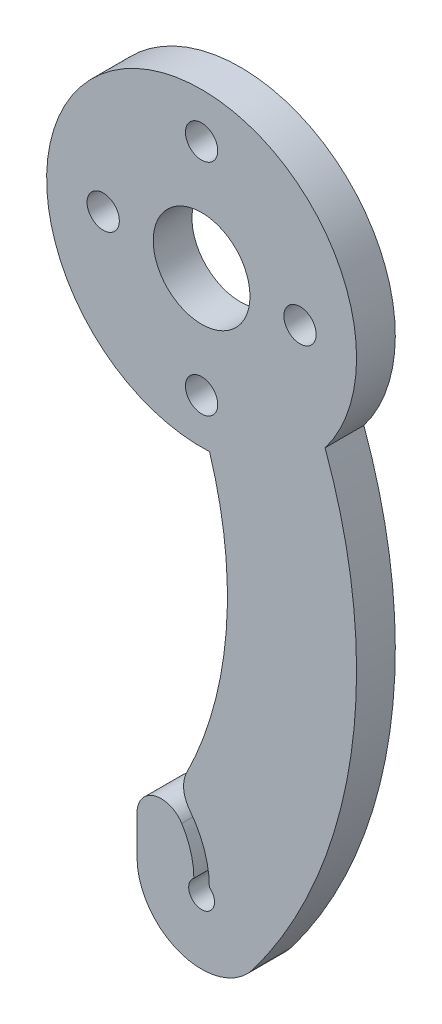
ISO-10303-21;
HEADER;
FILE_DESCRIPTION(('STEP AP214'),'2;1');
FILE_NAME('part.step','',(''),(''),'','','');
FILE_SCHEMA(('AUTOMOTIVE_DESIGN { 1 0 10303 214 1 1 1 1 }'));
ENDSEC;
DATA;
#1=APPLICATION_CONTEXT('core data for automotive mechanical design processes');
#2=APPLICATION_PROTOCOL_DEFINITION('international standard','automotive_design',2000,#1);
#3=PRODUCT_CONTEXT('',#1,'mechanical');
#4=PRODUCT('Part','Part','',(#3));
#5=PRODUCT_RELATED_PRODUCT_CATEGORY('part','',(#4));
#6=PRODUCT_DEFINITION_FORMATION('','',#4);
#7=PRODUCT_DEFINITION_CONTEXT('part definition',#1,'design');
#8=PRODUCT_DEFINITION('design','',#6,#7);
#9=PRODUCT_DEFINITION_SHAPE('','',#8);
#10=(LENGTH_UNIT() NAMED_UNIT(*) SI_UNIT(.MILLI.,.METRE.));
#11=(NAMED_UNIT(*) PLANE_ANGLE_UNIT() SI_UNIT($,.RADIAN.));
#12=(NAMED_UNIT(*) SI_UNIT($,.STERADIAN.) SOLID_ANGLE_UNIT());
#13=UNCERTAINTY_MEASURE_WITH_UNIT(LENGTH_MEASURE(1.E-05),#10,'distance_accuracy_value','');
#14=(GEOMETRIC_REPRESENTATION_CONTEXT(3) GLOBAL_UNCERTAINTY_ASSIGNED_CONTEXT((#13)) GLOBAL_UNIT_ASSIGNED_CONTEXT((#10,
#11,#12)) REPRESENTATION_CONTEXT('',''));
#15=CARTESIAN_POINT('',(0.,0.,0.));
#16=DIRECTION('',(0.,0.,1.));
#17=DIRECTION('',(1.,0.,0.));
#18=AXIS2_PLACEMENT_3D('',#15,#16,#17);
#19=CARTESIAN_POINT('',(-28.,-21.,3.));
#20=DIRECTION('',(0.,0.,-1.));
#21=DIRECTION('',(-1.,0.,0.));
#22=AXIS2_PLACEMENT_3D('',#19,#20,#21);
#23=PLANE('',#22);
#24=CARTESIAN_POINT('',(0.,-8.509,3.));
#25=DIRECTION('',(0.,0.,1.));
#26=DIRECTION('',(1.,0.,0.));
#27=AXIS2_PLACEMENT_3D('',#24,#25,#26);
#28=CIRCLE('',#27,1.25);
#29=CARTESIAN_POINT('',(1.25,-8.509,3.));
#30=VERTEX_POINT('',#29);
#31=EDGE_CURVE('E222',#30,#30,#28,.T.);
#32=ORIENTED_EDGE('',*,*,#31,.F.);
#33=EDGE_LOOP('',(#32));
#34=FACE_BOUND('',#33,.T.);
#35=CARTESIAN_POINT('',(0.,8.509,3.));
#36=DIRECTION('',(0.,0.,1.));
#37=DIRECTION('',(1.,0.,0.));
#38=AXIS2_PLACEMENT_3D('',#35,#36,#37);
#39=CIRCLE('',#38,1.25);
#40=CARTESIAN_POINT('',(1.24999999999999,8.509,3.));
#41=VERTEX_POINT('',#40);
#42=EDGE_CURVE('E210',#41,#41,#39,.T.);
#43=ORIENTED_EDGE('',*,*,#42,.F.);
#44=EDGE_LOOP('',(#43));
#45=FACE_BOUND('',#44,.T.);
#46=CARTESIAN_POINT('',(-28.,-21.,3.));
#47=DIRECTION('',(0.,0.,1.));
#48=DIRECTION('',(-1.,0.,0.));
#49=AXIS2_PLACEMENT_3D('',#46,#47,#48);
#50=CIRCLE('',#49,40.);
#51=CARTESIAN_POINT('',(4.00000000000001,-45.,3.));
#52=VERTEX_POINT('',#51);
#53=CARTESIAN_POINT('',(9.56239842829059,-7.24986457105411,3.));
#54=VERTEX_POINT('',#53);
#55=EDGE_CURVE('E159',#52,#54,#50,.T.);
#56=ORIENTED_EDGE('',*,*,#55,.T.);
#57=CARTESIAN_POINT('',(0.,0.,3.));
#58=DIRECTION('',(0.,0.,1.));
#59=DIRECTION('',(1.,0.,0.));
#60=AXIS2_PLACEMENT_3D('',#57,#58,#59);
#61=CIRCLE('',#60,12.);
#62=CARTESIAN_POINT('',(0.613240326656881,-11.9843204355425,3.));
#63=VERTEX_POINT('',#62);
#64=EDGE_CURVE('E97',#54,#63,#61,.T.);
#65=ORIENTED_EDGE('',*,*,#64,.T.);
#66=CARTESIAN_POINT('',(-28.,-21.,3.));
#67=DIRECTION('',(0.,0.,-1.));
#68=DIRECTION('',(-1.,0.,0.));
#69=AXIS2_PLACEMENT_3D('',#66,#67,#68);
#70=CIRCLE('',#69,30.);
#71=CARTESIAN_POINT('',(-1.15567211024812,-34.3933588075393,3.));
#72=VERTEX_POINT('',#71);
#73=EDGE_CURVE('E180',#63,#72,#70,.T.);
#74=ORIENTED_EDGE('',*,*,#73,.T.);
#75=CARTESIAN_POINT('',(0.867703118816565,-35.4028752519981,3.));
#76=DIRECTION('',(0.,0.,1.));
#77=DIRECTION('',(-1.,0.,0.));
#78=AXIS2_PLACEMENT_3D('',#75,#76,#77);
#79=CIRCLE('',#78,2.26123213519211);
#80=CARTESIAN_POINT('',(-0.915279992086807,-36.7936095887637,3.));
#81=VERTEX_POINT('',#80);
#82=EDGE_CURVE('E199',#72,#81,#79,.T.);
#83=ORIENTED_EDGE('',*,*,#82,.T.);
#84=CARTESIAN_POINT('',(-6.56446796105055,-41.2,3.));
#85=DIRECTION('',(0.,0.,-1.));
#86=DIRECTION('',(-1.,0.,0.));
#87=AXIS2_PLACEMENT_3D('',#84,#85,#86);
#88=CIRCLE('',#87,7.16446796105055);
#89=CARTESIAN_POINT('',(0.600000000000003,-41.2,3.));
#90=VERTEX_POINT('',#89);
#91=EDGE_CURVE('E196',#81,#90,#88,.T.);
#92=ORIENTED_EDGE('',*,*,#91,.T.);
#93=CARTESIAN_POINT('',(0.,-42.,3.));
#94=DIRECTION('',(0.,0.,-1.));
#95=DIRECTION('',(1.,0.,0.));
#96=AXIS2_PLACEMENT_3D('',#93,#94,#95);
#97=CIRCLE('',#96,1.);
#98=CARTESIAN_POINT('',(-0.599999999999995,-41.2,3.));
#99=VERTEX_POINT('',#98);
#100=EDGE_CURVE('E198',#90,#99,#97,.T.);
#101=ORIENTED_EDGE('',*,*,#100,.T.);
#102=CARTESIAN_POINT('',(-6.56446796105055,-41.2,3.));
#103=DIRECTION('',(0.,0.,1.));
#104=DIRECTION('',(-1.,0.,0.));
#105=AXIS2_PLACEMENT_3D('',#102,#103,#104);
#106=CIRCLE('',#105,5.96446796105056);
#107=CARTESIAN_POINT('',(-1.53841797830197,-37.9885050787349,3.));
#108=VERTEX_POINT('',#107);
#109=EDGE_CURVE('E122',#99,#108,#106,.T.);
#110=ORIENTED_EDGE('',*,*,#109,.T.);
#111=CARTESIAN_POINT('',(-3.12142656346644,-39.,3.));
#112=DIRECTION('',(0.,0.,1.));
#113=DIRECTION('',(-1.,0.,0.));
#114=AXIS2_PLACEMENT_3D('',#111,#112,#113);
#115=CIRCLE('',#114,1.87857343653356);
#116=CARTESIAN_POINT('',(-5.,-39.,3.));
#117=VERTEX_POINT('',#116);
#118=EDGE_CURVE('E116',#108,#117,#115,.T.);
#119=ORIENTED_EDGE('',*,*,#118,.T.);
#120=DIRECTION('',(0.,-1.,0.));
#121=VECTOR('',#120,1.);
#122=CARTESIAN_POINT('',(-4.99999999999999,-42.,3.));
#123=LINE('',#122,#121);
#124=CARTESIAN_POINT('',(-4.99999999999999,-42.,3.));
#125=VERTEX_POINT('',#124);
#126=EDGE_CURVE('E120',#117,#125,#123,.T.);
#127=ORIENTED_EDGE('',*,*,#126,.T.);
#128=CARTESIAN_POINT('',(0.,-42.,3.));
#129=DIRECTION('',(0.,0.,1.));
#130=DIRECTION('',(-1.,0.,0.));
#131=AXIS2_PLACEMENT_3D('',#128,#129,#130);
#132=CIRCLE('',#131,5.);
#133=EDGE_CURVE('E48',#125,#52,#132,.T.);
#134=ORIENTED_EDGE('',*,*,#133,.T.);
#135=EDGE_LOOP('',(#56,#65,#74,#83,#92,#101,#110,#119,#127,#134));
#136=FACE_BOUND('',#135,.T.);
#137=CARTESIAN_POINT('',(0.,0.,3.));
#138=DIRECTION('',(0.,0.,1.));
#139=DIRECTION('',(1.,0.,0.));
#140=AXIS2_PLACEMENT_3D('',#137,#138,#139);
#141=CIRCLE('',#140,3.7465);
#142=CARTESIAN_POINT('',(3.74649999999999,0.,3.));
#143=VERTEX_POINT('',#142);
#144=EDGE_CURVE('E144',#143,#143,#141,.T.);
#145=ORIENTED_EDGE('',*,*,#144,.F.);
#146=EDGE_LOOP('',(#145));
#147=FACE_BOUND('',#146,.T.);
#148=CARTESIAN_POINT('',(-7.62,0.,3.));
#149=DIRECTION('',(0.,0.,1.));
#150=DIRECTION('',(1.,0.,0.));
#151=AXIS2_PLACEMENT_3D('',#148,#149,#150);
#152=CIRCLE('',#151,1.25);
#153=CARTESIAN_POINT('',(-6.37,0.,3.));
#154=VERTEX_POINT('',#153);
#155=EDGE_CURVE('E216',#154,#154,#152,.T.);
#156=ORIENTED_EDGE('',*,*,#155,.F.);
#157=EDGE_LOOP('',(#156));
#158=FACE_BOUND('',#157,.T.);
#159=CARTESIAN_POINT('',(7.62,0.,3.));
#160=DIRECTION('',(0.,0.,1.));
#161=DIRECTION('',(1.,0.,0.));
#162=AXIS2_PLACEMENT_3D('',#159,#160,#161);
#163=CIRCLE('',#162,1.25);
#164=CARTESIAN_POINT('',(8.87,0.,3.));
#165=VERTEX_POINT('',#164);
#166=EDGE_CURVE('E228',#165,#165,#163,.T.);
#167=ORIENTED_EDGE('',*,*,#166,.F.);
#168=EDGE_LOOP('',(#167));
#169=FACE_BOUND('',#168,.T.);
#170=ADVANCED_FACE('F31',(#34,#45,#136,#147,#158,#169),#23,.F.);
#171=CARTESIAN_POINT('',(-28.,-21.,0.));
#172=DIRECTION('',(0.,0.,-1.));
#173=DIRECTION('',(-1.,0.,0.));
#174=AXIS2_PLACEMENT_3D('',#171,#172,#173);
#175=PLANE('',#174);
#176=CARTESIAN_POINT('',(0.,-8.509,0.));
#177=DIRECTION('',(0.,0.,1.));
#178=DIRECTION('',(1.,0.,0.));
#179=AXIS2_PLACEMENT_3D('',#176,#177,#178);
#180=CIRCLE('',#179,1.25);
#181=CARTESIAN_POINT('',(1.25,-8.509,0.));
#182=VERTEX_POINT('',#181);
#183=EDGE_CURVE('E225',#182,#182,#180,.T.);
#184=ORIENTED_EDGE('',*,*,#183,.T.);
#185=EDGE_LOOP('',(#184));
#186=FACE_BOUND('',#185,.T.);
#187=CARTESIAN_POINT('',(0.,8.509,0.));
#188=DIRECTION('',(0.,0.,1.));
#189=DIRECTION('',(1.,0.,0.));
#190=AXIS2_PLACEMENT_3D('',#187,#188,#189);
#191=CIRCLE('',#190,1.25);
#192=CARTESIAN_POINT('',(1.24999999999999,8.509,0.));
#193=VERTEX_POINT('',#192);
#194=EDGE_CURVE('E213',#193,#193,#191,.T.);
#195=ORIENTED_EDGE('',*,*,#194,.T.);
#196=EDGE_LOOP('',(#195));
#197=FACE_BOUND('',#196,.T.);
#198=CARTESIAN_POINT('',(-28.,-21.,0.));
#199=DIRECTION('',(0.,0.,1.));
#200=DIRECTION('',(-1.,0.,0.));
#201=AXIS2_PLACEMENT_3D('',#198,#199,#200);
#202=CIRCLE('',#201,40.);
#203=CARTESIAN_POINT('',(4.00000000000001,-45.,0.));
#204=VERTEX_POINT('',#203);
#205=CARTESIAN_POINT('',(9.56239842829059,-7.24986457105411,0.));
#206=VERTEX_POINT('',#205);
#207=EDGE_CURVE('E140',#204,#206,#202,.T.);
#208=ORIENTED_EDGE('',*,*,#207,.F.);
#209=CARTESIAN_POINT('',(0.,-42.,0.));
#210=DIRECTION('',(0.,0.,1.));
#211=DIRECTION('',(-1.,0.,0.));
#212=AXIS2_PLACEMENT_3D('',#209,#210,#211);
#213=CIRCLE('',#212,5.);
#214=CARTESIAN_POINT('',(-4.99999999999999,-42.,0.));
#215=VERTEX_POINT('',#214);
#216=EDGE_CURVE('E89',#215,#204,#213,.T.);
#217=ORIENTED_EDGE('',*,*,#216,.F.);
#218=DIRECTION('',(0.,-1.,0.));
#219=VECTOR('',#218,1.);
#220=CARTESIAN_POINT('',(-4.99999999999999,-42.,0.));
#221=LINE('',#220,#219);
#222=CARTESIAN_POINT('',(-5.,-39.,0.));
#223=VERTEX_POINT('',#222);
#224=EDGE_CURVE('E83',#223,#215,#221,.T.);
#225=ORIENTED_EDGE('',*,*,#224,.F.);
#226=CARTESIAN_POINT('',(-3.12142656346644,-39.,0.));
#227=DIRECTION('',(0.,0.,1.));
#228=DIRECTION('',(-1.,0.,0.));
#229=AXIS2_PLACEMENT_3D('',#226,#227,#228);
#230=CIRCLE('',#229,1.87857343653356);
#231=CARTESIAN_POINT('',(-1.53841797830197,-37.9885050787349,0.));
#232=VERTEX_POINT('',#231);
#233=EDGE_CURVE('E130',#232,#223,#230,.T.);
#234=ORIENTED_EDGE('',*,*,#233,.F.);
#235=CARTESIAN_POINT('',(-6.56446796105055,-41.2,0.));
#236=DIRECTION('',(0.,0.,1.));
#237=DIRECTION('',(-1.,0.,0.));
#238=AXIS2_PLACEMENT_3D('',#235,#236,#237);
#239=CIRCLE('',#238,5.96446796105056);
#240=CARTESIAN_POINT('',(-0.599999999999995,-41.2,0.));
#241=VERTEX_POINT('',#240);
#242=EDGE_CURVE('E154',#241,#232,#239,.T.);
#243=ORIENTED_EDGE('',*,*,#242,.F.);
#244=CARTESIAN_POINT('',(0.,-42.,0.));
#245=DIRECTION('',(0.,0.,-1.));
#246=DIRECTION('',(1.,0.,0.));
#247=AXIS2_PLACEMENT_3D('',#244,#245,#246);
#248=CIRCLE('',#247,1.);
#249=CARTESIAN_POINT('',(0.600000000000003,-41.2,0.));
#250=VERTEX_POINT('',#249);
#251=EDGE_CURVE('E152',#250,#241,#248,.T.);
#252=ORIENTED_EDGE('',*,*,#251,.F.);
#253=CARTESIAN_POINT('',(-6.56446796105055,-41.2,0.));
#254=DIRECTION('',(0.,0.,-1.));
#255=DIRECTION('',(-1.,0.,0.));
#256=AXIS2_PLACEMENT_3D('',#253,#254,#255);
#257=CIRCLE('',#256,7.16446796105055);
#258=CARTESIAN_POINT('',(-0.915279992086807,-36.7936095887637,0.));
#259=VERTEX_POINT('',#258);
#260=EDGE_CURVE('E150',#259,#250,#257,.T.);
#261=ORIENTED_EDGE('',*,*,#260,.F.);
#262=CARTESIAN_POINT('',(0.867703118816565,-35.4028752519981,0.));
#263=DIRECTION('',(0.,0.,1.));
#264=DIRECTION('',(-1.,0.,0.));
#265=AXIS2_PLACEMENT_3D('',#262,#263,#264);
#266=CIRCLE('',#265,2.26123213519211);
#267=CARTESIAN_POINT('',(-1.15567211024812,-34.3933588075393,0.));
#268=VERTEX_POINT('',#267);
#269=EDGE_CURVE('E148',#268,#259,#266,.T.);
#270=ORIENTED_EDGE('',*,*,#269,.F.);
#271=CARTESIAN_POINT('',(-28.,-21.,0.));
#272=DIRECTION('',(0.,0.,-1.));
#273=DIRECTION('',(-1.,0.,0.));
#274=AXIS2_PLACEMENT_3D('',#271,#272,#273);
#275=CIRCLE('',#274,30.);
#276=CARTESIAN_POINT('',(0.613240326656881,-11.9843204355425,0.));
#277=VERTEX_POINT('',#276);
#278=EDGE_CURVE('E146',#277,#268,#275,.T.);
#279=ORIENTED_EDGE('',*,*,#278,.F.);
#280=CARTESIAN_POINT('',(0.,0.,0.));
#281=DIRECTION('',(0.,0.,1.));
#282=DIRECTION('',(1.,0.,0.));
#283=AXIS2_PLACEMENT_3D('',#280,#281,#282);
#284=CIRCLE('',#283,12.);
#285=EDGE_CURVE('E143',#206,#277,#284,.T.);
#286=ORIENTED_EDGE('',*,*,#285,.F.);
#287=EDGE_LOOP('',(#208,#217,#225,#234,#243,#252,#261,#270,#279,#286));
#288=FACE_BOUND('',#287,.T.);
#289=CARTESIAN_POINT('',(0.,0.,0.));
#290=DIRECTION('',(0.,0.,1.));
#291=DIRECTION('',(1.,0.,0.));
#292=AXIS2_PLACEMENT_3D('',#289,#290,#291);
#293=CIRCLE('',#292,3.7465);
#294=CARTESIAN_POINT('',(3.74649999999999,0.,0.));
#295=VERTEX_POINT('',#294);
#296=EDGE_CURVE('E207',#295,#295,#293,.T.);
#297=ORIENTED_EDGE('',*,*,#296,.T.);
#298=EDGE_LOOP('',(#297));
#299=FACE_BOUND('',#298,.T.);
#300=CARTESIAN_POINT('',(-7.62,0.,0.));
#301=DIRECTION('',(0.,0.,1.));
#302=DIRECTION('',(1.,0.,0.));
#303=AXIS2_PLACEMENT_3D('',#300,#301,#302);
#304=CIRCLE('',#303,1.25);
#305=CARTESIAN_POINT('',(-6.37,0.,0.));
#306=VERTEX_POINT('',#305);
#307=EDGE_CURVE('E219',#306,#306,#304,.T.);
#308=ORIENTED_EDGE('',*,*,#307,.T.);
#309=EDGE_LOOP('',(#308));
#310=FACE_BOUND('',#309,.T.);
#311=CARTESIAN_POINT('',(7.62,0.,0.));
#312=DIRECTION('',(0.,0.,1.));
#313=DIRECTION('',(1.,0.,0.));
#314=AXIS2_PLACEMENT_3D('',#311,#312,#313);
#315=CIRCLE('',#314,1.25);
#316=CARTESIAN_POINT('',(8.87,0.,0.));
#317=VERTEX_POINT('',#316);
#318=EDGE_CURVE('E231',#317,#317,#315,.T.);
#319=ORIENTED_EDGE('',*,*,#318,.T.);
#320=EDGE_LOOP('',(#319));
#321=FACE_BOUND('',#320,.T.);
#322=ADVANCED_FACE('F184',(#186,#197,#288,#299,#310,#321),#175,.T.);
#323=CARTESIAN_POINT('',(-28.,-21.,3.));
#324=DIRECTION('',(0.,0.,-1.));
#325=DIRECTION('',(-1.,0.,0.));
#326=AXIS2_PLACEMENT_3D('',#323,#324,#325);
#327=CYLINDRICAL_SURFACE('',#326,40.);
#328=ORIENTED_EDGE('',*,*,#207,.T.);
#329=DIRECTION('',(0.,0.,-1.));
#330=VECTOR('',#329,1.);
#331=CARTESIAN_POINT('',(9.56239842829059,-7.24986457105411,3.));
#332=LINE('',#331,#330);
#333=EDGE_CURVE('E11',#54,#206,#332,.T.);
#334=ORIENTED_EDGE('',*,*,#333,.F.);
#335=ORIENTED_EDGE('',*,*,#55,.F.);
#336=DIRECTION('',(0.,0.,-1.));
#337=VECTOR('',#336,1.);
#338=CARTESIAN_POINT('',(4.00000000000001,-45.,3.));
#339=LINE('',#338,#337);
#340=EDGE_CURVE('E136',#52,#204,#339,.T.);
#341=ORIENTED_EDGE('',*,*,#340,.T.);
#342=EDGE_LOOP('',(#328,#334,#335,#341));
#343=FACE_BOUND('',#342,.T.);
#344=ADVANCED_FACE('F33',(#343),#327,.T.);
#345=CARTESIAN_POINT('',(0.,0.,3.));
#346=DIRECTION('',(0.,0.,-1.));
#347=DIRECTION('',(-1.,0.,0.));
#348=AXIS2_PLACEMENT_3D('',#345,#346,#347);
#349=CYLINDRICAL_SURFACE('',#348,12.);
#350=ORIENTED_EDGE('',*,*,#285,.T.);
#351=DIRECTION('',(0.,0.,-1.));
#352=VECTOR('',#351,1.);
#353=CARTESIAN_POINT('',(0.613240326656881,-11.9843204355425,3.));
#354=LINE('',#353,#352);
#355=EDGE_CURVE('E40',#63,#277,#354,.T.);
#356=ORIENTED_EDGE('',*,*,#355,.F.);
#357=ORIENTED_EDGE('',*,*,#64,.F.);
#358=ORIENTED_EDGE('',*,*,#333,.T.);
#359=EDGE_LOOP('',(#350,#356,#357,#358));
#360=FACE_BOUND('',#359,.T.);
#361=ADVANCED_FACE('F274',(#360),#349,.T.);
#362=CARTESIAN_POINT('',(-28.,-21.,3.));
#363=DIRECTION('',(0.,0.,-1.));
#364=DIRECTION('',(-1.,0.,0.));
#365=AXIS2_PLACEMENT_3D('',#362,#363,#364);
#366=CYLINDRICAL_SURFACE('',#365,30.);
#367=ORIENTED_EDGE('',*,*,#278,.T.);
#368=DIRECTION('',(0.,0.,-1.));
#369=VECTOR('',#368,1.);
#370=CARTESIAN_POINT('',(-1.15567211024812,-34.3933588075393,3.));
#371=LINE('',#370,#369);
#372=EDGE_CURVE('E172',#72,#268,#371,.T.);
#373=ORIENTED_EDGE('',*,*,#372,.F.);
#374=ORIENTED_EDGE('',*,*,#73,.F.);
#375=ORIENTED_EDGE('',*,*,#355,.T.);
#376=EDGE_LOOP('',(#367,#373,#374,#375));
#377=FACE_BOUND('',#376,.T.);
#378=ADVANCED_FACE('F178',(#377),#366,.F.);
#379=CARTESIAN_POINT('',(0.867703118816565,-35.4028752519981,3.));
#380=DIRECTION('',(0.,0.,-1.));
#381=DIRECTION('',(-1.,0.,0.));
#382=AXIS2_PLACEMENT_3D('',#379,#380,#381);
#383=CYLINDRICAL_SURFACE('',#382,2.26123213519211);
#384=ORIENTED_EDGE('',*,*,#269,.T.);
#385=DIRECTION('',(0.,0.,-1.));
#386=VECTOR('',#385,1.);
#387=CARTESIAN_POINT('',(-0.915279992086807,-36.7936095887637,3.));
#388=LINE('',#387,#386);
#389=EDGE_CURVE('E169',#81,#259,#388,.T.);
#390=ORIENTED_EDGE('',*,*,#389,.F.);
#391=ORIENTED_EDGE('',*,*,#82,.F.);
#392=ORIENTED_EDGE('',*,*,#372,.T.);
#393=EDGE_LOOP('',(#384,#390,#391,#392));
#394=FACE_BOUND('',#393,.T.);
#395=ADVANCED_FACE('F190',(#394),#383,.T.);
#396=CARTESIAN_POINT('',(-6.56446796105055,-41.2,3.));
#397=DIRECTION('',(0.,0.,-1.));
#398=DIRECTION('',(-1.,0.,0.));
#399=AXIS2_PLACEMENT_3D('',#396,#397,#398);
#400=CYLINDRICAL_SURFACE('',#399,7.16446796105055);
#401=ORIENTED_EDGE('',*,*,#260,.T.);
#402=DIRECTION('',(0.,0.,-1.));
#403=VECTOR('',#402,1.);
#404=CARTESIAN_POINT('',(0.600000000000003,-41.2,3.));
#405=LINE('',#404,#403);
#406=EDGE_CURVE('E166',#90,#250,#405,.T.);
#407=ORIENTED_EDGE('',*,*,#406,.F.);
#408=ORIENTED_EDGE('',*,*,#91,.F.);
#409=ORIENTED_EDGE('',*,*,#389,.T.);
#410=EDGE_LOOP('',(#401,#407,#408,#409));
#411=FACE_BOUND('',#410,.T.);
#412=ADVANCED_FACE('F194',(#411),#400,.F.);
#413=CARTESIAN_POINT('',(0.,-42.,3.));
#414=DIRECTION('',(0.,0.,-1.));
#415=DIRECTION('',(-1.,0.,0.));
#416=AXIS2_PLACEMENT_3D('',#413,#414,#415);
#417=CYLINDRICAL_SURFACE('',#416,1.);
#418=ORIENTED_EDGE('',*,*,#251,.T.);
#419=DIRECTION('',(0.,0.,-1.));
#420=VECTOR('',#419,1.);
#421=CARTESIAN_POINT('',(-0.599999999999995,-41.2,3.));
#422=LINE('',#421,#420);
#423=EDGE_CURVE('E163',#99,#241,#422,.T.);
#424=ORIENTED_EDGE('',*,*,#423,.F.);
#425=ORIENTED_EDGE('',*,*,#100,.F.);
#426=ORIENTED_EDGE('',*,*,#406,.T.);
#427=EDGE_LOOP('',(#418,#424,#425,#426));
#428=FACE_BOUND('',#427,.T.);
#429=ADVANCED_FACE('F264',(#428),#417,.F.);
#430=CARTESIAN_POINT('',(-6.56446796105055,-41.2,3.));
#431=DIRECTION('',(0.,0.,-1.));
#432=DIRECTION('',(-1.,0.,0.));
#433=AXIS2_PLACEMENT_3D('',#430,#431,#432);
#434=CYLINDRICAL_SURFACE('',#433,5.96446796105056);
#435=ORIENTED_EDGE('',*,*,#242,.T.);
#436=DIRECTION('',(0.,0.,-1.));
#437=VECTOR('',#436,1.);
#438=CARTESIAN_POINT('',(-1.53841797830197,-37.9885050787349,3.));
#439=LINE('',#438,#437);
#440=EDGE_CURVE('E131',#108,#232,#439,.T.);
#441=ORIENTED_EDGE('',*,*,#440,.F.);
#442=ORIENTED_EDGE('',*,*,#109,.F.);
#443=ORIENTED_EDGE('',*,*,#423,.T.);
#444=EDGE_LOOP('',(#435,#441,#442,#443));
#445=FACE_BOUND('',#444,.T.);
#446=ADVANCED_FACE('F261',(#445),#434,.T.);
#447=CARTESIAN_POINT('',(-3.12142656346644,-39.,3.));
#448=DIRECTION('',(0.,0.,-1.));
#449=DIRECTION('',(-1.,0.,0.));
#450=AXIS2_PLACEMENT_3D('',#447,#448,#449);
#451=CYLINDRICAL_SURFACE('',#450,1.87857343653356);
#452=ORIENTED_EDGE('',*,*,#233,.T.);
#453=DIRECTION('',(0.,0.,-1.));
#454=VECTOR('',#453,1.);
#455=CARTESIAN_POINT('',(-5.,-39.,3.));
#456=LINE('',#455,#454);
#457=EDGE_CURVE('E127',#117,#223,#456,.T.);
#458=ORIENTED_EDGE('',*,*,#457,.F.);
#459=ORIENTED_EDGE('',*,*,#118,.F.);
#460=ORIENTED_EDGE('',*,*,#440,.T.);
#461=EDGE_LOOP('',(#452,#458,#459,#460));
#462=FACE_BOUND('',#461,.T.);
#463=ADVANCED_FACE('F128',(#462),#451,.T.);
#464=CARTESIAN_POINT('',(-4.99999999999999,-42.,3.));
#465=DIRECTION('',(1.,0.,0.));
#466=DIRECTION('',(0.,1.,0.));
#467=AXIS2_PLACEMENT_3D('',#464,#465,#466);
#468=PLANE('',#467);
#469=ORIENTED_EDGE('',*,*,#224,.T.);
#470=DIRECTION('',(0.,0.,-1.));
#471=VECTOR('',#470,1.);
#472=CARTESIAN_POINT('',(-4.99999999999999,-42.,3.));
#473=LINE('',#472,#471);
#474=EDGE_CURVE('E132',#125,#215,#473,.T.);
#475=ORIENTED_EDGE('',*,*,#474,.F.);
#476=ORIENTED_EDGE('',*,*,#126,.F.);
#477=ORIENTED_EDGE('',*,*,#457,.T.);
#478=EDGE_LOOP('',(#469,#475,#476,#477));
#479=FACE_BOUND('',#478,.T.);
#480=ADVANCED_FACE('F134',(#479),#468,.F.);
#481=CARTESIAN_POINT('',(0.,-42.,3.));
#482=DIRECTION('',(0.,0.,-1.));
#483=DIRECTION('',(-1.,0.,0.));
#484=AXIS2_PLACEMENT_3D('',#481,#482,#483);
#485=CYLINDRICAL_SURFACE('',#484,5.);
#486=ORIENTED_EDGE('',*,*,#216,.T.);
#487=ORIENTED_EDGE('',*,*,#340,.F.);
#488=ORIENTED_EDGE('',*,*,#133,.F.);
#489=ORIENTED_EDGE('',*,*,#474,.T.);
#490=EDGE_LOOP('',(#486,#487,#488,#489));
#491=FACE_BOUND('',#490,.T.);
#492=ADVANCED_FACE('F254',(#491),#485,.T.);
#493=CARTESIAN_POINT('',(0.,0.,3.));
#494=DIRECTION('',(0.,0.,-1.));
#495=DIRECTION('',(-1.,0.,0.));
#496=AXIS2_PLACEMENT_3D('',#493,#494,#495);
#497=CYLINDRICAL_SURFACE('',#496,3.7465);
#498=ORIENTED_EDGE('',*,*,#144,.T.);
#499=EDGE_LOOP('',(#498));
#500=FACE_BOUND('',#499,.T.);
#501=ORIENTED_EDGE('',*,*,#296,.F.);
#502=EDGE_LOOP('',(#501));
#503=FACE_BOUND('',#502,.T.);
#504=ADVANCED_FACE('F251',(#500,#503),#497,.F.);
#505=CARTESIAN_POINT('',(0.,8.509,3.));
#506=DIRECTION('',(0.,0.,-1.));
#507=DIRECTION('',(-1.,0.,0.));
#508=AXIS2_PLACEMENT_3D('',#505,#506,#507);
#509=CYLINDRICAL_SURFACE('',#508,1.25);
#510=ORIENTED_EDGE('',*,*,#42,.T.);
#511=EDGE_LOOP('',(#510));
#512=FACE_BOUND('',#511,.T.);
#513=ORIENTED_EDGE('',*,*,#194,.F.);
#514=EDGE_LOOP('',(#513));
#515=FACE_BOUND('',#514,.T.);
#516=ADVANCED_FACE('F350',(#512,#515),#509,.F.);
#517=CARTESIAN_POINT('',(-7.62,0.,3.));
#518=DIRECTION('',(0.,0.,-1.));
#519=DIRECTION('',(-1.,0.,0.));
#520=AXIS2_PLACEMENT_3D('',#517,#518,#519);
#521=CYLINDRICAL_SURFACE('',#520,1.25);
#522=ORIENTED_EDGE('',*,*,#155,.T.);
#523=EDGE_LOOP('',(#522));
#524=FACE_BOUND('',#523,.T.);
#525=ORIENTED_EDGE('',*,*,#307,.F.);
#526=EDGE_LOOP('',(#525));
#527=FACE_BOUND('',#526,.T.);
#528=ADVANCED_FACE('F358',(#524,#527),#521,.F.);
#529=CARTESIAN_POINT('',(0.,-8.509,3.));
#530=DIRECTION('',(0.,0.,-1.));
#531=DIRECTION('',(-1.,0.,0.));
#532=AXIS2_PLACEMENT_3D('',#529,#530,#531);
#533=CYLINDRICAL_SURFACE('',#532,1.25);
#534=ORIENTED_EDGE('',*,*,#31,.T.);
#535=EDGE_LOOP('',(#534));
#536=FACE_BOUND('',#535,.T.);
#537=ORIENTED_EDGE('',*,*,#183,.F.);
#538=EDGE_LOOP('',(#537));
#539=FACE_BOUND('',#538,.T.);
#540=ADVANCED_FACE('F366',(#536,#539),#533,.F.);
#541=CARTESIAN_POINT('',(7.62,0.,3.));
#542=DIRECTION('',(0.,0.,-1.));
#543=DIRECTION('',(-1.,0.,0.));
#544=AXIS2_PLACEMENT_3D('',#541,#542,#543);
#545=CYLINDRICAL_SURFACE('',#544,1.25);
#546=ORIENTED_EDGE('',*,*,#166,.T.);
#547=EDGE_LOOP('',(#546));
#548=FACE_BOUND('',#547,.T.);
#549=ORIENTED_EDGE('',*,*,#318,.F.);
#550=EDGE_LOOP('',(#549));
#551=FACE_BOUND('',#550,.T.);
#552=ADVANCED_FACE('F237',(#548,#551),#545,.F.);
#553=CLOSED_SHELL('',(#170,#322,#344,#361,#378,#395,#412,#429,#446,#463,#480,#492,#504,#516,
#528,#540,#552));
#554=MANIFOLD_SOLID_BREP('B2',#553);
#555=ADVANCED_BREP_SHAPE_REPRESENTATION('',(#18,#554),#14);
#556=SHAPE_DEFINITION_REPRESENTATION(#9,#555);
ENDSEC;
END-ISO-10303-21;
